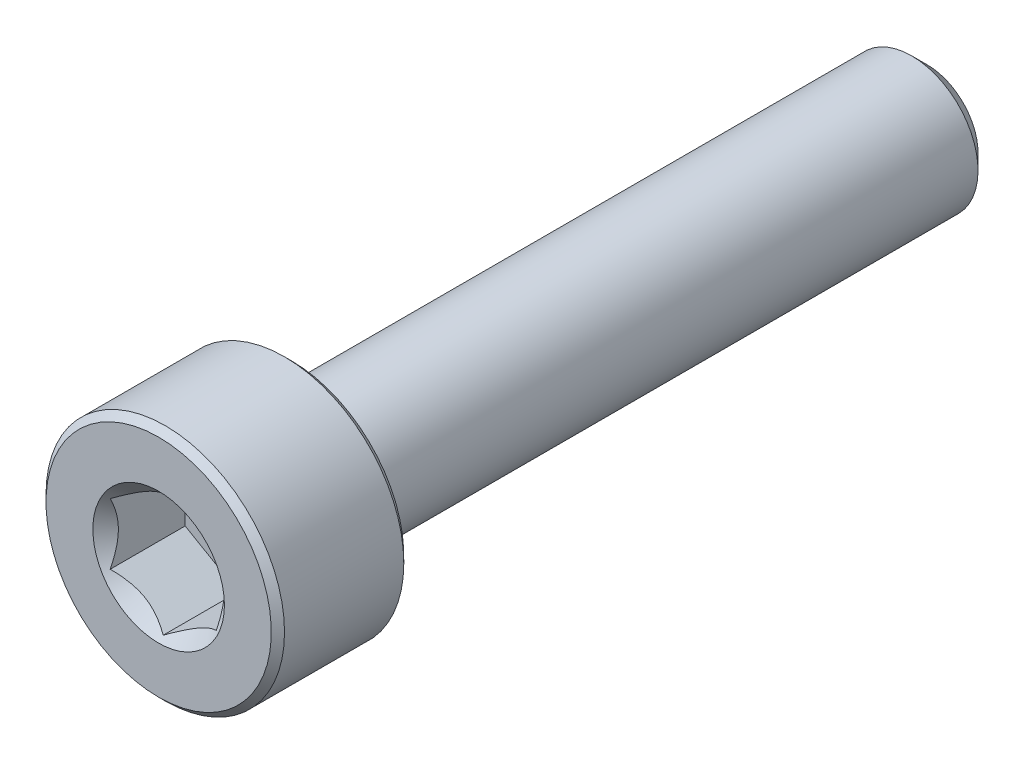
ISO-10303-21;
HEADER;
FILE_DESCRIPTION(('STEP AP214'),'2;1');
FILE_NAME('part.step','',(''),(''),'','','');
FILE_SCHEMA(('AUTOMOTIVE_DESIGN { 1 0 10303 214 1 1 1 1 }'));
ENDSEC;
DATA;
#1=APPLICATION_CONTEXT('core data for automotive mechanical design processes');
#2=APPLICATION_PROTOCOL_DEFINITION('international standard','automotive_design',2000,#1);
#3=PRODUCT_CONTEXT('',#1,'mechanical');
#4=PRODUCT('Part','Part','',(#3));
#5=PRODUCT_RELATED_PRODUCT_CATEGORY('part','',(#4));
#6=PRODUCT_DEFINITION_FORMATION('','',#4);
#7=PRODUCT_DEFINITION_CONTEXT('part definition',#1,'design');
#8=PRODUCT_DEFINITION('design','',#6,#7);
#9=PRODUCT_DEFINITION_SHAPE('','',#8);
#10=(LENGTH_UNIT() NAMED_UNIT(*) SI_UNIT(.MILLI.,.METRE.));
#11=(NAMED_UNIT(*) PLANE_ANGLE_UNIT() SI_UNIT($,.RADIAN.));
#12=(NAMED_UNIT(*) SI_UNIT($,.STERADIAN.) SOLID_ANGLE_UNIT());
#13=UNCERTAINTY_MEASURE_WITH_UNIT(LENGTH_MEASURE(1.E-05),#10,'distance_accuracy_value','');
#14=(GEOMETRIC_REPRESENTATION_CONTEXT(3) GLOBAL_UNCERTAINTY_ASSIGNED_CONTEXT((#13)) GLOBAL_UNIT_ASSIGNED_CONTEXT((#10,
#11,#12)) REPRESENTATION_CONTEXT('',''));
#15=CARTESIAN_POINT('',(0.,0.,0.));
#16=DIRECTION('',(0.,0.,1.));
#17=DIRECTION('',(1.,0.,0.));
#18=AXIS2_PLACEMENT_3D('',#15,#16,#17);
#19=CARTESIAN_POINT('',(0.,0.,4.625));
#20=DIRECTION('',(0.,0.,-1.));
#21=DIRECTION('',(0.,1.,0.));
#22=AXIS2_PLACEMENT_3D('',#19,#20,#21);
#23=TOROIDAL_SURFACE('',#22,1.375,0.125);
#24=CARTESIAN_POINT('',(0.,0.,4.75));
#25=DIRECTION('',(0.,0.,-1.));
#26=DIRECTION('',(0.,1.,0.));
#27=AXIS2_PLACEMENT_3D('',#24,#25,#26);
#28=CIRCLE('',#27,1.375);
#29=CARTESIAN_POINT('',(0.,1.375,4.75));
#30=VERTEX_POINT('',#29);
#31=EDGE_CURVE('E247',#30,#30,#28,.T.);
#32=ORIENTED_EDGE('',*,*,#31,.T.);
#33=EDGE_LOOP('',(#32));
#34=FACE_BOUND('',#33,.T.);
#35=CARTESIAN_POINT('',(0.,0.,4.625));
#36=DIRECTION('',(0.,0.,-1.));
#37=DIRECTION('',(0.,1.,0.));
#38=AXIS2_PLACEMENT_3D('',#35,#36,#37);
#39=CIRCLE('',#38,1.25);
#40=CARTESIAN_POINT('',(0.,1.25,4.625));
#41=VERTEX_POINT('',#40);
#42=EDGE_CURVE('E55',#41,#41,#39,.T.);
#43=ORIENTED_EDGE('',*,*,#42,.F.);
#44=EDGE_LOOP('',(#43));
#45=FACE_BOUND('',#44,.T.);
#46=ADVANCED_FACE('F50',(#34,#45),#23,.F.);
#47=CARTESIAN_POINT('',(0.,2.125,4.75));
#48=DIRECTION('',(0.,0.,-1.));
#49=DIRECTION('',(0.,1.,0.));
#50=AXIS2_PLACEMENT_3D('',#47,#48,#49);
#51=PLANE('',#50);
#52=CARTESIAN_POINT('',(0.,0.,4.75));
#53=DIRECTION('',(0.,0.,-1.));
#54=DIRECTION('',(0.,1.,0.));
#55=AXIS2_PLACEMENT_3D('',#52,#53,#54);
#56=CIRCLE('',#55,2.125);
#57=CARTESIAN_POINT('',(0.,2.125,4.75));
#58=VERTEX_POINT('',#57);
#59=EDGE_CURVE('E249',#58,#58,#56,.T.);
#60=ORIENTED_EDGE('',*,*,#59,.T.);
#61=EDGE_LOOP('',(#60));
#62=FACE_BOUND('',#61,.T.);
#63=ORIENTED_EDGE('',*,*,#31,.F.);
#64=EDGE_LOOP('',(#63));
#65=FACE_BOUND('',#64,.T.);
#66=ADVANCED_FACE('F117',(#62,#65),#51,.T.);
#67=CARTESIAN_POINT('',(0.,0.,4.75));
#68=DIRECTION('',(0.,0.,1.));
#69=DIRECTION('',(0.,-1.,0.));
#70=AXIS2_PLACEMENT_3D('',#67,#68,#69);
#71=CONICAL_SURFACE('',#70,2.125,0.78539816339745);
#72=CARTESIAN_POINT('',(0.,0.,4.875));
#73=DIRECTION('',(0.,0.,-1.));
#74=DIRECTION('',(0.,1.,0.));
#75=AXIS2_PLACEMENT_3D('',#72,#73,#74);
#76=CIRCLE('',#75,2.25);
#77=CARTESIAN_POINT('',(0.,2.25,4.875));
#78=VERTEX_POINT('',#77);
#79=EDGE_CURVE('E258',#78,#78,#76,.T.);
#80=ORIENTED_EDGE('',*,*,#79,.T.);
#81=EDGE_LOOP('',(#80));
#82=FACE_BOUND('',#81,.T.);
#83=ORIENTED_EDGE('',*,*,#59,.F.);
#84=EDGE_LOOP('',(#83));
#85=FACE_BOUND('',#84,.T.);
#86=ADVANCED_FACE('F122',(#82,#85),#71,.T.);
#87=CARTESIAN_POINT('',(0.,0.,-7.25));
#88=DIRECTION('',(0.,0.,-1.));
#89=DIRECTION('',(0.,1.,0.));
#90=AXIS2_PLACEMENT_3D('',#87,#88,#89);
#91=CYLINDRICAL_SURFACE('',#90,2.25);
#92=CARTESIAN_POINT('',(0.,0.,7.125));
#93=DIRECTION('',(0.,0.,-1.));
#94=DIRECTION('',(0.,1.,0.));
#95=AXIS2_PLACEMENT_3D('',#92,#93,#94);
#96=CIRCLE('',#95,2.25);
#97=CARTESIAN_POINT('',(0.,2.25,7.125));
#98=VERTEX_POINT('',#97);
#99=EDGE_CURVE('E237',#98,#98,#96,.T.);
#100=ORIENTED_EDGE('',*,*,#99,.T.);
#101=EDGE_LOOP('',(#100));
#102=FACE_BOUND('',#101,.T.);
#103=ORIENTED_EDGE('',*,*,#79,.F.);
#104=EDGE_LOOP('',(#103));
#105=FACE_BOUND('',#104,.T.);
#106=ADVANCED_FACE('F130',(#102,#105),#91,.T.);
#107=CARTESIAN_POINT('',(0.,0.,7.125));
#108=DIRECTION('',(0.,0.,-1.));
#109=DIRECTION('',(0.,1.,0.));
#110=AXIS2_PLACEMENT_3D('',#107,#108,#109);
#111=CONICAL_SURFACE('',#110,2.25,0.78539816339745);
#112=CARTESIAN_POINT('',(0.,0.,7.25));
#113=DIRECTION('',(0.,0.,-1.));
#114=DIRECTION('',(0.,1.,0.));
#115=AXIS2_PLACEMENT_3D('',#112,#113,#114);
#116=CIRCLE('',#115,2.125);
#117=CARTESIAN_POINT('',(0.,2.125,7.25));
#118=VERTEX_POINT('',#117);
#119=EDGE_CURVE('E234',#118,#118,#116,.T.);
#120=ORIENTED_EDGE('',*,*,#119,.T.);
#121=EDGE_LOOP('',(#120));
#122=FACE_BOUND('',#121,.T.);
#123=ORIENTED_EDGE('',*,*,#99,.F.);
#124=EDGE_LOOP('',(#123));
#125=FACE_BOUND('',#124,.T.);
#126=ADVANCED_FACE('F134',(#122,#125),#111,.T.);
#127=CARTESIAN_POINT('',(0.,0.,7.25));
#128=DIRECTION('',(0.,0.,1.));
#129=DIRECTION('',(0.,-1.,0.));
#130=AXIS2_PLACEMENT_3D('',#127,#128,#129);
#131=PLANE('',#130);
#132=CARTESIAN_POINT('',(0.,0.,7.25));
#133=DIRECTION('',(0.,0.,1.));
#134=DIRECTION('',(1.,0.,0.));
#135=AXIS2_PLACEMENT_3D('',#132,#133,#134);
#136=CIRCLE('',#135,1.2413030787577);
#137=CARTESIAN_POINT('',(1.2413030787577,0.,7.25));
#138=VERTEX_POINT('',#137);
#139=EDGE_CURVE('E12',#138,#138,#136,.T.);
#140=ORIENTED_EDGE('',*,*,#139,.F.);
#141=EDGE_LOOP('',(#140));
#142=FACE_BOUND('',#141,.T.);
#143=ORIENTED_EDGE('',*,*,#119,.F.);
#144=EDGE_LOOP('',(#143));
#145=FACE_BOUND('',#144,.T.);
#146=ADVANCED_FACE('F138',(#142,#145),#131,.T.);
#147=CARTESIAN_POINT('',(0.,0.,7.25));
#148=DIRECTION('',(0.,0.,1.));
#149=DIRECTION('',(1.,0.,0.));
#150=AXIS2_PLACEMENT_3D('',#147,#148,#149);
#151=CONICAL_SURFACE('',#150,1.2413030787577,0.78539816339745);
#152=ORIENTED_EDGE('',*,*,#139,.T.);
#153=EDGE_LOOP('',(#152));
#154=FACE_BOUND('',#153,.T.);
#155=CARTESIAN_POINT('',(-0.000199999999999783,-1.15481600843309,7.16351294699417));
#156=CARTESIAN_POINT('',(0.0341825950071806,-1.13496520795026,7.14367539044729));
#157=CARTESIAN_POINT('',(0.0691401181398247,-1.11478247255942,7.12500248026044));
#158=CARTESIAN_POINT('',(0.140422802956089,-1.07362739529219,7.09081220234471));
#159=CARTESIAN_POINT('',(0.176754750528984,-1.0526511355808,7.07531386864501));
#160=CARTESIAN_POINT('',(0.250016613803311,-1.01035337909803,7.04876476676382));
#161=CARTESIAN_POINT('',(0.286927851445414,-0.989042666109241,7.03764723361848));
#162=CARTESIAN_POINT('',(0.361562729310859,-0.945952199282692,7.02051732539774));
#163=CARTESIAN_POINT('',(0.399284088108635,-0.924173762626597,7.01449215708823));
#164=CARTESIAN_POINT('',(0.464292198417933,-0.886641312640015,7.00905801458905));
#165=CARTESIAN_POINT('',(0.491494371528172,-0.870936130672276,7.00825439793829));
#166=CARTESIAN_POINT('',(0.545846040669111,-0.839556179862849,7.00960415903844));
#167=CARTESIAN_POINT('',(0.572995523754875,-0.823881418494924,7.01175818916875));
#168=CARTESIAN_POINT('',(0.65405627732696,-0.777080970599367,7.02251443175003));
#169=CARTESIAN_POINT('',(0.707564140978427,-0.74618819111643,7.03541201603691));
#170=CARTESIAN_POINT('',(0.801476065143431,-0.69196811641965,7.06653819022373));
#171=CARTESIAN_POINT('',(0.842320523671834,-0.668386557293372,7.08313525732339));
#172=CARTESIAN_POINT('',(0.922409637381943,-0.622147085933681,7.12052238430685));
#173=CARTESIAN_POINT('',(0.961659010870438,-0.599486449584575,7.14129880143896));
#174=CARTESIAN_POINT('',(1.0002,-0.577234799135788,7.16351294699417));
#175=B_SPLINE_CURVE_WITH_KNOTS('',3,(#155,#156,#157,#158,#159,#160,#161,#162,#163,#164,#165,
#166,#167,#168,#169,#170,#171,#172,#173,#174),.UNSPECIFIED.,.F.,.F.,(4,2,2,2,2,2,2,2,2,4),(0.,
0.133237676828559,0.26725222983449,0.3991370762693,0.530689603280768,0.624814864263846,
0.718960890149133,0.907306626112097,1.05710100361789,1.20641411519286),.UNSPECIFIED.);
#176=CARTESIAN_POINT('',(0.,-1.15470053837925,7.16339745962156));
#177=VERTEX_POINT('',#176);
#178=CARTESIAN_POINT('',(1.,-0.577350269189626,7.16339745962156));
#179=VERTEX_POINT('',#178);
#180=EDGE_CURVE('E67',#177,#179,#175,.T.);
#181=ORIENTED_EDGE('',*,*,#180,.F.);
#182=CARTESIAN_POINT('',(-1.0002,-0.577234799135788,7.16351294699417));
#183=CARTESIAN_POINT('',(-0.965817404992819,-0.597085599618622,7.14367539044729));
#184=CARTESIAN_POINT('',(-0.930859881860175,-0.617268335009456,7.12500248026045));
#185=CARTESIAN_POINT('',(-0.85957719704391,-0.658423412276686,7.09081220234471));
#186=CARTESIAN_POINT('',(-0.823245249471016,-0.67939967198808,7.07531386864501));
#187=CARTESIAN_POINT('',(-0.749983386196689,-0.721697428470846,7.04876476676382));
#188=CARTESIAN_POINT('',(-0.713072148554585,-0.743008141459637,7.03764723361848));
#189=CARTESIAN_POINT('',(-0.638437270689141,-0.786098608286186,7.02051732539774));
#190=CARTESIAN_POINT('',(-0.600715911891364,-0.807877044942281,7.01449215708823));
#191=CARTESIAN_POINT('',(-0.535707801582066,-0.845409494928863,7.00905801458905));
#192=CARTESIAN_POINT('',(-0.508505628471827,-0.861114676896602,7.00825439793829));
#193=CARTESIAN_POINT('',(-0.454153959330887,-0.892494627706029,7.00960415903844));
#194=CARTESIAN_POINT('',(-0.427004476245124,-0.908169389073954,7.01175818916875));
#195=CARTESIAN_POINT('',(-0.345943722673039,-0.954969836969511,7.02251443175003));
#196=CARTESIAN_POINT('',(-0.292435859021572,-0.985862616452447,7.03541201603691));
#197=CARTESIAN_POINT('',(-0.198523934856568,-1.04008269114923,7.06653819022373));
#198=CARTESIAN_POINT('',(-0.157679476328165,-1.06366425027551,7.08313525732339));
#199=CARTESIAN_POINT('',(-0.0775903626180557,-1.1099037216352,7.12052238430685));
#200=CARTESIAN_POINT('',(-0.0383409891295617,-1.1325643579843,7.14129880143896));
#201=CARTESIAN_POINT('',(0.000200000000000583,-1.15481600843309,7.16351294699417));
#202=B_SPLINE_CURVE_WITH_KNOTS('',3,(#182,#183,#184,#185,#186,#187,#188,#189,#190,#191,#192,
#193,#194,#195,#196,#197,#198,#199,#200,#201),.UNSPECIFIED.,.F.,.F.,(4,2,2,2,2,2,2,2,2,4),(0.,
0.133237676828559,0.267252229834491,0.3991370762693,0.530689603280769,0.624814864263847,
0.718960890149134,0.907306626112098,1.05710100361789,1.20641411519286),.UNSPECIFIED.);
#203=CARTESIAN_POINT('',(-1.,-0.577350269189626,7.16339745962156));
#204=VERTEX_POINT('',#203);
#205=EDGE_CURVE('E60',#204,#177,#202,.T.);
#206=ORIENTED_EDGE('',*,*,#205,.F.);
#207=CARTESIAN_POINT('',(-1.,-1.21199087789934,7.57997725527287));
#208=CARTESIAN_POINT('',(-1.,-1.18273650300522,7.55741554693661));
#209=CARTESIAN_POINT('',(-1.,-1.15332592158341,7.53505703381193));
#210=CARTESIAN_POINT('',(-1.,-1.09412680336146,7.4908320719692));
#211=CARTESIAN_POINT('',(-1.,-1.06433818018076,7.46896573899681));
#212=CARTESIAN_POINT('',(-1.,-0.97387129354152,7.4039212875776));
#213=CARTESIAN_POINT('',(-1.,-0.912535008128867,7.3616436137258));
#214=CARTESIAN_POINT('',(-1.,-0.783508251342875,7.27806824785001));
#215=CARTESIAN_POINT('',(-1.,-0.715662620346606,7.23700761033256));
#216=CARTESIAN_POINT('',(-1.,-0.576509894905891,7.16150147066944));
#217=CARTESIAN_POINT('',(-1.,-0.505215555513883,7.12703362621591));
#218=CARTESIAN_POINT('',(-1.,-0.398764046939012,7.08484878246325));
#219=CARTESIAN_POINT('',(-1.,-0.365313297980423,7.07284938948254));
#220=CARTESIAN_POINT('',(-1.,-0.297551245132093,7.05153030995285));
#221=CARTESIAN_POINT('',(-1.,-0.263239887100777,7.04221079245894));
#222=CARTESIAN_POINT('',(-1.,-0.194571067470056,7.02691167587498));
#223=CARTESIAN_POINT('',(-1.,-0.160227555987668,7.02087048308474));
#224=CARTESIAN_POINT('',(-1.,-0.0910948269867766,7.01225224503757));
#225=CARTESIAN_POINT('',(-1.,-0.0563055613802756,7.009675576765));
#226=CARTESIAN_POINT('',(-1.,0.0117927152654021,7.00821295512037));
#227=CARTESIAN_POINT('',(-1.,0.0450983170825075,7.00916703835344));
#228=CARTESIAN_POINT('',(-1.,0.111441413420384,7.01434362211099));
#229=CARTESIAN_POINT('',(-1.,0.144478971732107,7.01856532046785));
#230=CARTESIAN_POINT('',(-1.,0.210624763290572,7.03010847896862));
#231=CARTESIAN_POINT('',(-1.,0.243723154740698,7.03748543479042));
#232=CARTESIAN_POINT('',(-1.,0.309187738497536,7.05492899920948));
#233=CARTESIAN_POINT('',(-1.,0.341553969590706,7.06499546496534));
#234=CARTESIAN_POINT('',(-1.,0.440875348086756,7.09974257065232));
#235=CARTESIAN_POINT('',(-1.,0.506480526276306,7.1282699754181));
#236=CARTESIAN_POINT('',(-1.,0.634628446237199,7.19175922476326));
#237=CARTESIAN_POINT('',(-1.,0.697159414671816,7.22674368431451));
#238=CARTESIAN_POINT('',(-1.,0.816694357126198,7.29898555821879));
#239=CARTESIAN_POINT('',(-1.,0.873818851530728,7.33604607035742));
#240=CARTESIAN_POINT('',(-1.,0.957979712513755,7.39336695643995));
#241=CARTESIAN_POINT('',(-1.,0.985671461150836,7.41268175945423));
#242=CARTESIAN_POINT('',(-1.,1.04067496120981,7.45182989264588));
#243=CARTESIAN_POINT('',(-1.,1.06798681474316,7.47166307919343));
#244=CARTESIAN_POINT('',(-1.,1.09514019811391,7.49171143685736));
#245=B_SPLINE_CURVE_WITH_KNOTS('',3,(#207,#208,#209,#210,#211,#212,#213,#214,#215,#216,#217,
#218,#219,#220,#221,#222,#223,#224,#225,#226,#227,#228,#229,#230,#231,#232,#233,#234,#235,#236,
#237,#238,#239,#240,#241,#242,#243,#244),.UNSPECIFIED.,.F.,.F.,(4,2,2,2,2,2,2,2,2,2,2,2,2,2,2,2,
2,2,4),(0.,0.110828944200308,0.221683685263867,0.445078388583645,0.682811068621036,
0.919723239940847,1.02624790401867,1.13277928653702,1.23723298361624,1.34169804566787,
1.44148938783186,1.54125623996228,1.64285505347063,1.74444847208079,1.95844200767913,
2.17319976124347,2.3773768581412,2.47865984803709,2.57991506662171),.UNSPECIFIED.);
#246=CARTESIAN_POINT('',(-1.,0.577350269189625,7.16339745962156));
#247=VERTEX_POINT('',#246);
#248=EDGE_CURVE('E176',#247,#204,#245,.F.);
#249=ORIENTED_EDGE('',*,*,#248,.F.);
#250=CARTESIAN_POINT('',(0.000199999999999878,1.15481600843309,7.16351294699417));
#251=CARTESIAN_POINT('',(-0.0341825950071804,1.13496520795026,7.14367539044729));
#252=CARTESIAN_POINT('',(-0.0691401181398245,1.11478247255942,7.12500248026044));
#253=CARTESIAN_POINT('',(-0.140422802956089,1.07362739529219,7.09081220234471));
#254=CARTESIAN_POINT('',(-0.176754750528984,1.0526511355808,7.07531386864501));
#255=CARTESIAN_POINT('',(-0.250016613803311,1.01035337909803,7.04876476676382));
#256=CARTESIAN_POINT('',(-0.286927851445414,0.989042666109241,7.03764723361848));
#257=CARTESIAN_POINT('',(-0.361562729310859,0.945952199282692,7.02051732539774));
#258=CARTESIAN_POINT('',(-0.399284088108635,0.924173762626597,7.01449215708823));
#259=CARTESIAN_POINT('',(-0.464292198417933,0.886641312640015,7.00905801458905));
#260=CARTESIAN_POINT('',(-0.491494371528171,0.870936130672276,7.00825439793829));
#261=CARTESIAN_POINT('',(-0.545846040669111,0.839556179862849,7.00960415903844));
#262=CARTESIAN_POINT('',(-0.572995523754875,0.823881418494924,7.01175818916875));
#263=CARTESIAN_POINT('',(-0.654056277326959,0.777080970599367,7.02251443175003));
#264=CARTESIAN_POINT('',(-0.707564140978426,0.746188191116431,7.03541201603691));
#265=CARTESIAN_POINT('',(-0.801476065143431,0.69196811641965,7.06653819022373));
#266=CARTESIAN_POINT('',(-0.842320523671834,0.668386557293371,7.08313525732339));
#267=CARTESIAN_POINT('',(-0.922409637381944,0.622147085933681,7.12052238430685));
#268=CARTESIAN_POINT('',(-0.961659010870438,0.599486449584575,7.14129880143896));
#269=CARTESIAN_POINT('',(-1.0002,0.577234799135787,7.16351294699417));
#270=B_SPLINE_CURVE_WITH_KNOTS('',3,(#250,#251,#252,#253,#254,#255,#256,#257,#258,#259,#260,
#261,#262,#263,#264,#265,#266,#267,#268,#269),.UNSPECIFIED.,.F.,.F.,(4,2,2,2,2,2,2,2,2,4),(0.,
0.133237676828559,0.26725222983449,0.3991370762693,0.530689603280768,0.624814864263845,
0.718960890149132,0.907306626112096,1.05710100361789,1.20641411519286),.UNSPECIFIED.);
#271=CARTESIAN_POINT('',(0.,1.15470053837925,7.16339745962156));
#272=VERTEX_POINT('',#271);
#273=EDGE_CURVE('E169',#272,#247,#270,.T.);
#274=ORIENTED_EDGE('',*,*,#273,.F.);
#275=CARTESIAN_POINT('',(1.0002,0.577234799135788,7.16351294699417));
#276=CARTESIAN_POINT('',(0.965817404992819,0.597085599618622,7.14367539044729));
#277=CARTESIAN_POINT('',(0.930859881860175,0.617268335009456,7.12500248026045));
#278=CARTESIAN_POINT('',(0.85957719704391,0.658423412276686,7.09081220234471));
#279=CARTESIAN_POINT('',(0.823245249471016,0.67939967198808,7.07531386864501));
#280=CARTESIAN_POINT('',(0.749983386196689,0.721697428470846,7.04876476676382));
#281=CARTESIAN_POINT('',(0.713072148554586,0.743008141459637,7.03764723361848));
#282=CARTESIAN_POINT('',(0.638437270689141,0.786098608286186,7.02051732539774));
#283=CARTESIAN_POINT('',(0.600715911891364,0.807877044942281,7.01449215708823));
#284=CARTESIAN_POINT('',(0.535707801582066,0.845409494928863,7.00905801458905));
#285=CARTESIAN_POINT('',(0.508505628471827,0.861114676896602,7.00825439793829));
#286=CARTESIAN_POINT('',(0.454153959330887,0.892494627706029,7.00960415903844));
#287=CARTESIAN_POINT('',(0.427004476245124,0.908169389073954,7.01175818916875));
#288=CARTESIAN_POINT('',(0.345943722673039,0.954969836969511,7.02251443175003));
#289=CARTESIAN_POINT('',(0.292435859021572,0.985862616452448,7.03541201603691));
#290=CARTESIAN_POINT('',(0.198523934856568,1.04008269114923,7.06653819022373));
#291=CARTESIAN_POINT('',(0.157679476328165,1.06366425027551,7.08313525732339));
#292=CARTESIAN_POINT('',(0.0775903626180558,1.1099037216352,7.12052238430685));
#293=CARTESIAN_POINT('',(0.0383409891295618,1.1325643579843,7.14129880143896));
#294=CARTESIAN_POINT('',(-0.00020000000000038,1.15481600843309,7.16351294699417));
#295=B_SPLINE_CURVE_WITH_KNOTS('',3,(#275,#276,#277,#278,#279,#280,#281,#282,#283,#284,#285,
#286,#287,#288,#289,#290,#291,#292,#293,#294),.UNSPECIFIED.,.F.,.F.,(4,2,2,2,2,2,2,2,2,4),(0.,
0.133237676828559,0.26725222983449,0.399137076269301,0.530689603280769,0.624814864263847,
0.718960890149134,0.907306626112098,1.05710100361789,1.20641411519286),.UNSPECIFIED.);
#296=CARTESIAN_POINT('',(1.,0.577350269189626,7.16339745962156));
#297=VERTEX_POINT('',#296);
#298=EDGE_CURVE('E160',#297,#272,#295,.T.);
#299=ORIENTED_EDGE('',*,*,#298,.F.);
#300=CARTESIAN_POINT('',(1.,-1.21199087789934,7.57997725527287));
#301=CARTESIAN_POINT('',(1.,-1.18273650300521,7.55741554693661));
#302=CARTESIAN_POINT('',(1.,-1.15332592158341,7.53505703381193));
#303=CARTESIAN_POINT('',(1.,-1.09412680336146,7.4908320719692));
#304=CARTESIAN_POINT('',(1.,-1.06433818018075,7.46896573899681));
#305=CARTESIAN_POINT('',(1.,-0.973871293541519,7.4039212875776));
#306=CARTESIAN_POINT('',(1.,-0.912535008128866,7.3616436137258));
#307=CARTESIAN_POINT('',(1.,-0.783508251342875,7.27806824785001));
#308=CARTESIAN_POINT('',(1.,-0.715662620346606,7.23700761033256));
#309=CARTESIAN_POINT('',(1.,-0.576509894905891,7.16150147066944));
#310=CARTESIAN_POINT('',(1.,-0.505215555513883,7.12703362621591));
#311=CARTESIAN_POINT('',(1.,-0.398764046939012,7.08484878246325));
#312=CARTESIAN_POINT('',(1.,-0.365313297980423,7.07284938948254));
#313=CARTESIAN_POINT('',(1.,-0.297551245132093,7.05153030995285));
#314=CARTESIAN_POINT('',(1.,-0.263239887100777,7.04221079245894));
#315=CARTESIAN_POINT('',(1.,-0.194571067470056,7.02691167587498));
#316=CARTESIAN_POINT('',(1.,-0.160227555987667,7.02087048308474));
#317=CARTESIAN_POINT('',(1.,-0.0910948269867763,7.01225224503757));
#318=CARTESIAN_POINT('',(1.,-0.0563055613802753,7.009675576765));
#319=CARTESIAN_POINT('',(1.,0.0117927152654025,7.00821295512037));
#320=CARTESIAN_POINT('',(1.,0.0450983170825081,7.00916703835344));
#321=CARTESIAN_POINT('',(1.,0.111441413420384,7.01434362211099));
#322=CARTESIAN_POINT('',(1.,0.144478971732107,7.01856532046785));
#323=CARTESIAN_POINT('',(1.,0.210624763290573,7.03010847896862));
#324=CARTESIAN_POINT('',(1.,0.243723154740699,7.03748543479042));
#325=CARTESIAN_POINT('',(1.,0.309187738497536,7.05492899920948));
#326=CARTESIAN_POINT('',(1.,0.341553969590707,7.06499546496534));
#327=CARTESIAN_POINT('',(1.,0.440875348086756,7.09974257065232));
#328=CARTESIAN_POINT('',(1.,0.506480526276306,7.1282699754181));
#329=CARTESIAN_POINT('',(1.,0.634628446237199,7.19175922476326));
#330=CARTESIAN_POINT('',(1.,0.697159414671816,7.22674368431451));
#331=CARTESIAN_POINT('',(1.,0.816694357126198,7.29898555821879));
#332=CARTESIAN_POINT('',(1.,0.873818851530728,7.33604607035742));
#333=CARTESIAN_POINT('',(1.,0.957979712513755,7.39336695643995));
#334=CARTESIAN_POINT('',(1.,0.985671461150836,7.41268175945423));
#335=CARTESIAN_POINT('',(1.,1.04067496120981,7.45182989264588));
#336=CARTESIAN_POINT('',(1.,1.06798681474316,7.47166307919343));
#337=CARTESIAN_POINT('',(1.,1.09514019811391,7.49171143685736));
#338=B_SPLINE_CURVE_WITH_KNOTS('',3,(#300,#301,#302,#303,#304,#305,#306,#307,#308,#309,#310,
#311,#312,#313,#314,#315,#316,#317,#318,#319,#320,#321,#322,#323,#324,#325,#326,#327,#328,#329,
#330,#331,#332,#333,#334,#335,#336,#337),.UNSPECIFIED.,.F.,.F.,(4,2,2,2,2,2,2,2,2,2,2,2,2,2,2,2,
2,2,4),(0.,0.110828944200308,0.221683685263867,0.445078388583644,0.682811068621036,
0.919723239940846,1.02624790401867,1.13277928653702,1.23723298361624,1.34169804566787,
1.44148938783186,1.54125623996228,1.64285505347063,1.74444847208079,1.95844200767913,
2.17319976124347,2.3773768581412,2.47865984803709,2.57991506662171),.UNSPECIFIED.);
#339=EDGE_CURVE('E152',#179,#297,#338,.T.);
#340=ORIENTED_EDGE('',*,*,#339,.F.);
#341=EDGE_LOOP('',(#181,#206,#249,#274,#299,#340));
#342=FACE_BOUND('',#341,.T.);
#343=ADVANCED_FACE('F52',(#154,#342),#151,.F.);
#344=CARTESIAN_POINT('',(0.,2.125,5.75));
#345=DIRECTION('',(0.,0.,-1.));
#346=DIRECTION('',(0.,1.,0.));
#347=AXIS2_PLACEMENT_3D('',#344,#345,#346);
#348=PLANE('',#347);
#349=DIRECTION('',(0.866025403784438,0.5,0.));
#350=VECTOR('',#349,1.);
#351=CARTESIAN_POINT('',(0.,-1.15470053837925,5.75));
#352=LINE('',#351,#350);
#353=CARTESIAN_POINT('',(0.,-1.15470053837925,5.75));
#354=VERTEX_POINT('',#353);
#355=CARTESIAN_POINT('',(1.,-0.577350269189626,5.75));
#356=VERTEX_POINT('',#355);
#357=EDGE_CURVE('E221',#354,#356,#352,.T.);
#358=ORIENTED_EDGE('',*,*,#357,.T.);
#359=DIRECTION('',(0.,1.,0.));
#360=VECTOR('',#359,1.);
#361=CARTESIAN_POINT('',(1.,-0.577350269189626,5.75));
#362=LINE('',#361,#360);
#363=CARTESIAN_POINT('',(1.,0.577350269189626,5.75));
#364=VERTEX_POINT('',#363);
#365=EDGE_CURVE('E161',#356,#364,#362,.T.);
#366=ORIENTED_EDGE('',*,*,#365,.T.);
#367=DIRECTION('',(-0.866025403784439,0.5,0.));
#368=VECTOR('',#367,1.);
#369=CARTESIAN_POINT('',(1.,0.577350269189626,5.75));
#370=LINE('',#369,#368);
#371=CARTESIAN_POINT('',(0.,1.15470053837925,5.75));
#372=VERTEX_POINT('',#371);
#373=EDGE_CURVE('E222',#364,#372,#370,.T.);
#374=ORIENTED_EDGE('',*,*,#373,.T.);
#375=DIRECTION('',(-0.866025403784438,-0.5,0.));
#376=VECTOR('',#375,1.);
#377=CARTESIAN_POINT('',(0.,1.15470053837925,5.75));
#378=LINE('',#377,#376);
#379=CARTESIAN_POINT('',(-1.,0.577350269189626,5.75));
#380=VERTEX_POINT('',#379);
#381=EDGE_CURVE('E227',#372,#380,#378,.T.);
#382=ORIENTED_EDGE('',*,*,#381,.T.);
#383=DIRECTION('',(0.,-1.,0.));
#384=VECTOR('',#383,1.);
#385=CARTESIAN_POINT('',(-1.,0.577350269189626,5.75));
#386=LINE('',#385,#384);
#387=CARTESIAN_POINT('',(-1.,-0.577350269189626,5.75));
#388=VERTEX_POINT('',#387);
#389=EDGE_CURVE('E212',#380,#388,#386,.T.);
#390=ORIENTED_EDGE('',*,*,#389,.T.);
#391=DIRECTION('',(0.866025403784439,-0.5,0.));
#392=VECTOR('',#391,1.);
#393=CARTESIAN_POINT('',(-1.,-0.577350269189626,5.75));
#394=LINE('',#393,#392);
#395=EDGE_CURVE('E211',#388,#354,#394,.T.);
#396=ORIENTED_EDGE('',*,*,#395,.T.);
#397=EDGE_LOOP('',(#358,#366,#374,#382,#390,#396));
#398=FACE_BOUND('',#397,.T.);
#399=ADVANCED_FACE('F143',(#398),#348,.F.);
#400=CARTESIAN_POINT('',(0.,-1.15470053837925,1.69494953669611));
#401=DIRECTION('',(0.5,-0.866025403784438,0.));
#402=DIRECTION('',(0.866025403784438,0.5,0.));
#403=AXIS2_PLACEMENT_3D('',#400,#401,#402);
#404=PLANE('',#403);
#405=DIRECTION('',(0.,0.,1.));
#406=VECTOR('',#405,1.);
#407=CARTESIAN_POINT('',(0.,-1.15470053837925,1.69494953669611));
#408=LINE('',#407,#406);
#409=EDGE_CURVE('E215',#354,#177,#408,.T.);
#410=ORIENTED_EDGE('',*,*,#409,.T.);
#411=ORIENTED_EDGE('',*,*,#180,.T.);
#412=DIRECTION('',(0.,0.,1.));
#413=VECTOR('',#412,1.);
#414=CARTESIAN_POINT('',(1.,-0.577350269189626,1.69494953669611));
#415=LINE('',#414,#413);
#416=EDGE_CURVE('E230',#356,#179,#415,.T.);
#417=ORIENTED_EDGE('',*,*,#416,.F.);
#418=ORIENTED_EDGE('',*,*,#357,.F.);
#419=EDGE_LOOP('',(#410,#411,#417,#418));
#420=FACE_BOUND('',#419,.T.);
#421=ADVANCED_FACE('F145',(#420),#404,.F.);
#422=CARTESIAN_POINT('',(-1.,-0.577350269189626,1.69494953669611));
#423=DIRECTION('',(-0.5,-0.866025403784439,0.));
#424=DIRECTION('',(0.866025403784439,-0.5,0.));
#425=AXIS2_PLACEMENT_3D('',#422,#423,#424);
#426=PLANE('',#425);
#427=DIRECTION('',(0.,0.,1.));
#428=VECTOR('',#427,1.);
#429=CARTESIAN_POINT('',(-1.,-0.577350269189626,1.69494953669611));
#430=LINE('',#429,#428);
#431=EDGE_CURVE('E206',#388,#204,#430,.T.);
#432=ORIENTED_EDGE('',*,*,#431,.T.);
#433=ORIENTED_EDGE('',*,*,#205,.T.);
#434=ORIENTED_EDGE('',*,*,#409,.F.);
#435=ORIENTED_EDGE('',*,*,#395,.F.);
#436=EDGE_LOOP('',(#432,#433,#434,#435));
#437=FACE_BOUND('',#436,.T.);
#438=ADVANCED_FACE('F191',(#437),#426,.F.);
#439=CARTESIAN_POINT('',(-1.,0.577350269189626,1.69494953669611));
#440=DIRECTION('',(-1.,0.,0.));
#441=DIRECTION('',(0.,0.,1.));
#442=AXIS2_PLACEMENT_3D('',#439,#440,#441);
#443=PLANE('',#442);
#444=DIRECTION('',(0.,0.,1.));
#445=VECTOR('',#444,1.);
#446=CARTESIAN_POINT('',(-1.,0.577350269189626,1.69494953669611));
#447=LINE('',#446,#445);
#448=EDGE_CURVE('E209',#380,#247,#447,.T.);
#449=ORIENTED_EDGE('',*,*,#448,.T.);
#450=ORIENTED_EDGE('',*,*,#248,.T.);
#451=ORIENTED_EDGE('',*,*,#431,.F.);
#452=ORIENTED_EDGE('',*,*,#389,.F.);
#453=EDGE_LOOP('',(#449,#450,#451,#452));
#454=FACE_BOUND('',#453,.T.);
#455=ADVANCED_FACE('F186',(#454),#443,.F.);
#456=CARTESIAN_POINT('',(0.,1.15470053837925,1.69494953669611));
#457=DIRECTION('',(-0.5,0.866025403784438,0.));
#458=DIRECTION('',(-0.866025403784438,-0.5,0.));
#459=AXIS2_PLACEMENT_3D('',#456,#457,#458);
#460=PLANE('',#459);
#461=DIRECTION('',(0.,0.,1.));
#462=VECTOR('',#461,1.);
#463=CARTESIAN_POINT('',(0.,1.15470053837925,1.69494953669611));
#464=LINE('',#463,#462);
#465=EDGE_CURVE('E226',#372,#272,#464,.T.);
#466=ORIENTED_EDGE('',*,*,#465,.T.);
#467=ORIENTED_EDGE('',*,*,#273,.T.);
#468=ORIENTED_EDGE('',*,*,#448,.F.);
#469=ORIENTED_EDGE('',*,*,#381,.F.);
#470=EDGE_LOOP('',(#466,#467,#468,#469));
#471=FACE_BOUND('',#470,.T.);
#472=ADVANCED_FACE('F183',(#471),#460,.F.);
#473=CARTESIAN_POINT('',(1.,0.577350269189626,1.69494953669611));
#474=DIRECTION('',(0.5,0.866025403784439,0.));
#475=DIRECTION('',(-0.866025403784439,0.5,0.));
#476=AXIS2_PLACEMENT_3D('',#473,#474,#475);
#477=PLANE('',#476);
#478=DIRECTION('',(0.,0.,1.));
#479=VECTOR('',#478,1.);
#480=CARTESIAN_POINT('',(1.,0.577350269189626,1.69494953669611));
#481=LINE('',#480,#479);
#482=EDGE_CURVE('E225',#364,#297,#481,.T.);
#483=ORIENTED_EDGE('',*,*,#482,.T.);
#484=ORIENTED_EDGE('',*,*,#298,.T.);
#485=ORIENTED_EDGE('',*,*,#465,.F.);
#486=ORIENTED_EDGE('',*,*,#373,.F.);
#487=EDGE_LOOP('',(#483,#484,#485,#486));
#488=FACE_BOUND('',#487,.T.);
#489=ADVANCED_FACE('F111',(#488),#477,.F.);
#490=CARTESIAN_POINT('',(1.,-0.577350269189626,1.69494953669611));
#491=DIRECTION('',(1.,0.,0.));
#492=DIRECTION('',(0.,0.,-1.));
#493=AXIS2_PLACEMENT_3D('',#490,#491,#492);
#494=PLANE('',#493);
#495=ORIENTED_EDGE('',*,*,#416,.T.);
#496=ORIENTED_EDGE('',*,*,#339,.T.);
#497=ORIENTED_EDGE('',*,*,#482,.F.);
#498=ORIENTED_EDGE('',*,*,#365,.F.);
#499=EDGE_LOOP('',(#495,#496,#497,#498));
#500=FACE_BOUND('',#499,.T.);
#501=ADVANCED_FACE('F105',(#500),#494,.F.);
#502=CARTESIAN_POINT('',(0.,0.,3.90331216351296));
#503=DIRECTION('',(0.,0.,1.));
#504=DIRECTION('',(0.,-1.,0.));
#505=AXIS2_PLACEMENT_3D('',#502,#503,#504);
#506=CONICAL_SURFACE('',#505,0.,1.04719755119659);
#507=ORIENTED_EDGE('',*,*,#42,.T.);
#508=EDGE_LOOP('',(#507));
#509=FACE_BOUND('',#508,.T.);
#510=CARTESIAN_POINT('',(0.,0.,3.90331216351296));
#511=VERTEX_POINT('',#510);
#512=VERTEX_LOOP('',#511);
#513=FACE_BOUND('',#512,.T.);
#514=ADVANCED_FACE('F103',(#509,#513),#506,.T.);
#515=CLOSED_SHELL('',(#46,#66,#86,#106,#126,#146,#343,#399,#421,#438,#455,#472,#489,#501,#514));
#516=MANIFOLD_SOLID_BREP('B2',#515);
#517=CARTESIAN_POINT('',(-2.26,-2.25,4.625));
#518=DIRECTION('',(0.,0.,-1.));
#519=DIRECTION('',(-1.,0.,0.));
#520=AXIS2_PLACEMENT_3D('',#517,#518,#519);
#521=PLANE('',#520);
#522=CARTESIAN_POINT('',(0.,0.,4.625));
#523=DIRECTION('',(0.,0.,-1.));
#524=DIRECTION('',(0.,1.,0.));
#525=AXIS2_PLACEMENT_3D('',#522,#523,#524);
#526=CIRCLE('',#525,1.25);
#527=CARTESIAN_POINT('',(0.,1.25,4.625));
#528=VERTEX_POINT('',#527);
#529=EDGE_CURVE('E386',#528,#528,#526,.T.);
#530=ORIENTED_EDGE('',*,*,#529,.F.);
#531=EDGE_LOOP('',(#530));
#532=FACE_BOUND('',#531,.T.);
#533=ADVANCED_FACE('F376',(#532),#521,.F.);
#534=CARTESIAN_POINT('',(0.,0.957716426222752,-7.25));
#535=DIRECTION('',(0.,0.,-1.));
#536=DIRECTION('',(0.,1.,0.));
#537=AXIS2_PLACEMENT_3D('',#534,#535,#536);
#538=PLANE('',#537);
#539=CARTESIAN_POINT('',(0.,0.,-7.25));
#540=DIRECTION('',(0.,0.,-1.));
#541=DIRECTION('',(0.,1.,0.));
#542=AXIS2_PLACEMENT_3D('',#539,#540,#541);
#543=CIRCLE('',#542,0.957716426222752);
#544=CARTESIAN_POINT('',(0.,0.957716426222752,-7.25));
#545=VERTEX_POINT('',#544);
#546=EDGE_CURVE('E49',#545,#545,#543,.T.);
#547=ORIENTED_EDGE('',*,*,#546,.T.);
#548=EDGE_LOOP('',(#547));
#549=FACE_BOUND('',#548,.T.);
#550=ADVANCED_FACE('F397',(#549),#538,.T.);
#551=CARTESIAN_POINT('',(0.,0.,-7.25));
#552=DIRECTION('',(0.,0.,1.));
#553=DIRECTION('',(0.,-1.,0.));
#554=AXIS2_PLACEMENT_3D('',#551,#552,#553);
#555=CONICAL_SURFACE('',#554,0.957716426222752,0.785398163397446);
#556=CARTESIAN_POINT('',(0.,0.,-6.95771642622275));
#557=DIRECTION('',(0.,0.,-1.));
#558=DIRECTION('',(0.,1.,0.));
#559=AXIS2_PLACEMENT_3D('',#556,#557,#558);
#560=CIRCLE('',#559,1.25);
#561=CARTESIAN_POINT('',(0.,1.25,-6.95771642622275));
#562=VERTEX_POINT('',#561);
#563=EDGE_CURVE('E382',#562,#562,#560,.T.);
#564=ORIENTED_EDGE('',*,*,#563,.T.);
#565=EDGE_LOOP('',(#564));
#566=FACE_BOUND('',#565,.T.);
#567=ORIENTED_EDGE('',*,*,#546,.F.);
#568=EDGE_LOOP('',(#567));
#569=FACE_BOUND('',#568,.T.);
#570=ADVANCED_FACE('F401',(#566,#569),#555,.T.);
#571=CARTESIAN_POINT('',(0.,0.,-7.25));
#572=DIRECTION('',(0.,0.,-1.));
#573=DIRECTION('',(0.,1.,0.));
#574=AXIS2_PLACEMENT_3D('',#571,#572,#573);
#575=CYLINDRICAL_SURFACE('',#574,1.25);
#576=ORIENTED_EDGE('',*,*,#529,.T.);
#577=EDGE_LOOP('',(#576));
#578=FACE_BOUND('',#577,.T.);
#579=ORIENTED_EDGE('',*,*,#563,.F.);
#580=EDGE_LOOP('',(#579));
#581=FACE_BOUND('',#580,.T.);
#582=ADVANCED_FACE('F393',(#578,#581),#575,.T.);
#583=CLOSED_SHELL('',(#533,#550,#570,#582));
#584=MANIFOLD_SOLID_BREP('B6',#583);
#585=ADVANCED_BREP_SHAPE_REPRESENTATION('',(#18,#516,#584),#14);
#586=SHAPE_DEFINITION_REPRESENTATION(#9,#585);
ENDSEC;
END-ISO-10303-21;
